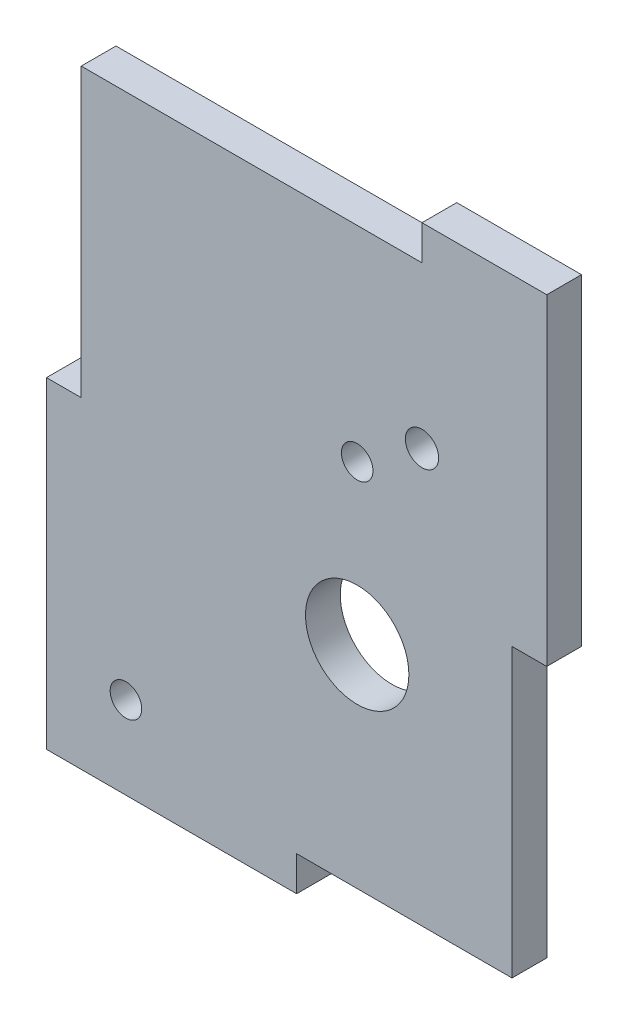
ISO-10303-21;
HEADER;
FILE_DESCRIPTION(('STEP AP214'),'2;1');
FILE_NAME('part.step','',(''),(''),'','','');
FILE_SCHEMA(('AUTOMOTIVE_DESIGN { 1 0 10303 214 1 1 1 1 }'));
ENDSEC;
DATA;
#1=APPLICATION_CONTEXT('core data for automotive mechanical design processes');
#2=APPLICATION_PROTOCOL_DEFINITION('international standard','automotive_design',2000,#1);
#3=PRODUCT_CONTEXT('',#1,'mechanical');
#4=PRODUCT('Part','Part','',(#3));
#5=PRODUCT_RELATED_PRODUCT_CATEGORY('part','',(#4));
#6=PRODUCT_DEFINITION_FORMATION('','',#4);
#7=PRODUCT_DEFINITION_CONTEXT('part definition',#1,'design');
#8=PRODUCT_DEFINITION('design','',#6,#7);
#9=PRODUCT_DEFINITION_SHAPE('','',#8);
#10=(LENGTH_UNIT() NAMED_UNIT(*) SI_UNIT(.MILLI.,.METRE.));
#11=(NAMED_UNIT(*) PLANE_ANGLE_UNIT() SI_UNIT($,.RADIAN.));
#12=(NAMED_UNIT(*) SI_UNIT($,.STERADIAN.) SOLID_ANGLE_UNIT());
#13=UNCERTAINTY_MEASURE_WITH_UNIT(LENGTH_MEASURE(1.E-05),#10,'distance_accuracy_value','');
#14=(GEOMETRIC_REPRESENTATION_CONTEXT(3) GLOBAL_UNCERTAINTY_ASSIGNED_CONTEXT((#13)) GLOBAL_UNIT_ASSIGNED_CONTEXT((#10,
#11,#12)) REPRESENTATION_CONTEXT('',''));
#15=CARTESIAN_POINT('',(0.,0.,0.));
#16=DIRECTION('',(0.,0.,1.));
#17=DIRECTION('',(1.,0.,0.));
#18=AXIS2_PLACEMENT_3D('',#15,#16,#17);
#19=CARTESIAN_POINT('',(19.05,0.,3.0734));
#20=DIRECTION('',(-1.,0.,0.));
#21=DIRECTION('',(0.,-1.,0.));
#22=AXIS2_PLACEMENT_3D('',#19,#20,#21);
#23=PLANE('',#22);
#24=DIRECTION('',(0.,1.,0.));
#25=VECTOR('',#24,1.);
#26=CARTESIAN_POINT('',(19.05,0.,0.));
#27=LINE('',#26,#25);
#28=CARTESIAN_POINT('',(19.05,-3.0734,0.));
#29=VERTEX_POINT('',#28);
#30=CARTESIAN_POINT('',(19.05,0.,0.));
#31=VERTEX_POINT('',#30);
#32=EDGE_CURVE('E168',#29,#31,#27,.T.);
#33=ORIENTED_EDGE('',*,*,#32,.T.);
#34=DIRECTION('',(0.,0.,-1.));
#35=VECTOR('',#34,1.);
#36=CARTESIAN_POINT('',(19.05,0.,3.0734));
#37=LINE('',#36,#35);
#38=CARTESIAN_POINT('',(19.05,0.,3.0734));
#39=VERTEX_POINT('',#38);
#40=EDGE_CURVE('E11',#39,#31,#37,.T.);
#41=ORIENTED_EDGE('',*,*,#40,.F.);
#42=DIRECTION('',(0.,1.,0.));
#43=VECTOR('',#42,1.);
#44=CARTESIAN_POINT('',(19.05,0.,3.0734));
#45=LINE('',#44,#43);
#46=CARTESIAN_POINT('',(19.05,-3.0734,3.0734));
#47=VERTEX_POINT('',#46);
#48=EDGE_CURVE('E209',#47,#39,#45,.T.);
#49=ORIENTED_EDGE('',*,*,#48,.F.);
#50=DIRECTION('',(0.,0.,-1.));
#51=VECTOR('',#50,1.);
#52=CARTESIAN_POINT('',(19.05,-3.0734,3.0734));
#53=LINE('',#52,#51);
#54=EDGE_CURVE('E167',#47,#29,#53,.T.);
#55=ORIENTED_EDGE('',*,*,#54,.T.);
#56=EDGE_LOOP('',(#33,#41,#49,#55));
#57=FACE_BOUND('',#56,.T.);
#58=ADVANCED_FACE('F35',(#57),#23,.F.);
#59=CARTESIAN_POINT('',(0.,0.,3.0734));
#60=DIRECTION('',(0.,1.,0.));
#61=DIRECTION('',(0.,0.,1.));
#62=AXIS2_PLACEMENT_3D('',#59,#60,#61);
#63=PLANE('',#62);
#64=DIRECTION('',(1.,0.,0.));
#65=VECTOR('',#64,1.);
#66=CARTESIAN_POINT('',(0.,0.,0.));
#67=LINE('',#66,#65);
#68=CARTESIAN_POINT('',(38.1,0.,0.));
#69=VERTEX_POINT('',#68);
#70=EDGE_CURVE('E171',#31,#69,#67,.T.);
#71=ORIENTED_EDGE('',*,*,#70,.T.);
#72=DIRECTION('',(0.,0.,-1.));
#73=VECTOR('',#72,1.);
#74=CARTESIAN_POINT('',(38.1,0.,3.0734));
#75=LINE('',#74,#73);
#76=CARTESIAN_POINT('',(38.1,0.,3.0734));
#77=VERTEX_POINT('',#76);
#78=EDGE_CURVE('E43',#77,#69,#75,.T.);
#79=ORIENTED_EDGE('',*,*,#78,.F.);
#80=DIRECTION('',(1.,0.,0.));
#81=VECTOR('',#80,1.);
#82=CARTESIAN_POINT('',(0.,0.,3.0734));
#83=LINE('',#82,#81);
#84=EDGE_CURVE('E106',#39,#77,#83,.T.);
#85=ORIENTED_EDGE('',*,*,#84,.F.);
#86=ORIENTED_EDGE('',*,*,#40,.T.);
#87=EDGE_LOOP('',(#71,#79,#85,#86));
#88=FACE_BOUND('',#87,.T.);
#89=ADVANCED_FACE('F281',(#88),#63,.F.);
#90=CARTESIAN_POINT('',(38.1,0.,3.0734));
#91=DIRECTION('',(-1.,0.,0.));
#92=DIRECTION('',(0.,0.,1.));
#93=AXIS2_PLACEMENT_3D('',#90,#91,#92);
#94=PLANE('',#93);
#95=DIRECTION('',(0.,1.,0.));
#96=VECTOR('',#95,1.);
#97=CARTESIAN_POINT('',(38.1,0.,0.));
#98=LINE('',#97,#96);
#99=CARTESIAN_POINT('',(38.1,25.4,0.));
#100=VERTEX_POINT('',#99);
#101=EDGE_CURVE('E173',#69,#100,#98,.T.);
#102=ORIENTED_EDGE('',*,*,#101,.T.);
#103=DIRECTION('',(0.,0.,-1.));
#104=VECTOR('',#103,1.);
#105=CARTESIAN_POINT('',(38.1,25.4,3.0734));
#106=LINE('',#105,#104);
#107=CARTESIAN_POINT('',(38.1,25.4,3.0734));
#108=VERTEX_POINT('',#107);
#109=EDGE_CURVE('E223',#108,#100,#106,.T.);
#110=ORIENTED_EDGE('',*,*,#109,.F.);
#111=DIRECTION('',(0.,1.,0.));
#112=VECTOR('',#111,1.);
#113=CARTESIAN_POINT('',(38.1,0.,3.0734));
#114=LINE('',#113,#112);
#115=EDGE_CURVE('E230',#77,#108,#114,.T.);
#116=ORIENTED_EDGE('',*,*,#115,.F.);
#117=ORIENTED_EDGE('',*,*,#78,.T.);
#118=EDGE_LOOP('',(#102,#110,#116,#117));
#119=FACE_BOUND('',#118,.T.);
#120=ADVANCED_FACE('F228',(#119),#94,.F.);
#121=CARTESIAN_POINT('',(0.,25.4,3.0734));
#122=DIRECTION('',(0.,-1.,0.));
#123=DIRECTION('',(0.,0.,-1.));
#124=AXIS2_PLACEMENT_3D('',#121,#122,#123);
#125=PLANE('',#124);
#126=DIRECTION('',(-1.,0.,0.));
#127=VECTOR('',#126,1.);
#128=CARTESIAN_POINT('',(0.,25.4,0.));
#129=LINE('',#128,#127);
#130=CARTESIAN_POINT('',(41.1734,25.4,0.));
#131=VERTEX_POINT('',#130);
#132=EDGE_CURVE('E176',#131,#100,#129,.T.);
#133=ORIENTED_EDGE('',*,*,#132,.F.);
#134=DIRECTION('',(0.,0.,-1.));
#135=VECTOR('',#134,1.);
#136=CARTESIAN_POINT('',(41.1734,25.4,3.0734));
#137=LINE('',#136,#135);
#138=CARTESIAN_POINT('',(41.1734,25.4,3.0734));
#139=VERTEX_POINT('',#138);
#140=EDGE_CURVE('E221',#139,#131,#137,.T.);
#141=ORIENTED_EDGE('',*,*,#140,.F.);
#142=DIRECTION('',(-1.,0.,0.));
#143=VECTOR('',#142,1.);
#144=CARTESIAN_POINT('',(0.,25.4,3.0734));
#145=LINE('',#144,#143);
#146=EDGE_CURVE('E241',#139,#108,#145,.T.);
#147=ORIENTED_EDGE('',*,*,#146,.T.);
#148=ORIENTED_EDGE('',*,*,#109,.T.);
#149=EDGE_LOOP('',(#133,#141,#147,#148));
#150=FACE_BOUND('',#149,.T.);
#151=ADVANCED_FACE('F238',(#150),#125,.T.);
#152=CARTESIAN_POINT('',(41.1734,0.,3.0734));
#153=DIRECTION('',(1.,0.,0.));
#154=DIRECTION('',(0.,1.,0.));
#155=AXIS2_PLACEMENT_3D('',#152,#153,#154);
#156=PLANE('',#155);
#157=DIRECTION('',(0.,-1.,0.));
#158=VECTOR('',#157,1.);
#159=CARTESIAN_POINT('',(41.1734,0.,0.));
#160=LINE('',#159,#158);
#161=CARTESIAN_POINT('',(41.1734,53.8734,0.));
#162=VERTEX_POINT('',#161);
#163=EDGE_CURVE('E179',#162,#131,#160,.T.);
#164=ORIENTED_EDGE('',*,*,#163,.F.);
#165=DIRECTION('',(0.,0.,-1.));
#166=VECTOR('',#165,1.);
#167=CARTESIAN_POINT('',(41.1734,53.8734,3.0734));
#168=LINE('',#167,#166);
#169=CARTESIAN_POINT('',(41.1734,53.8734,3.0734));
#170=VERTEX_POINT('',#169);
#171=EDGE_CURVE('E219',#170,#162,#168,.T.);
#172=ORIENTED_EDGE('',*,*,#171,.F.);
#173=DIRECTION('',(0.,-1.,0.));
#174=VECTOR('',#173,1.);
#175=CARTESIAN_POINT('',(41.1734,0.,3.0734));
#176=LINE('',#175,#174);
#177=EDGE_CURVE('E244',#170,#139,#176,.T.);
#178=ORIENTED_EDGE('',*,*,#177,.T.);
#179=ORIENTED_EDGE('',*,*,#140,.T.);
#180=EDGE_LOOP('',(#164,#172,#178,#179));
#181=FACE_BOUND('',#180,.T.);
#182=ADVANCED_FACE('F292',(#181),#156,.T.);
#183=CARTESIAN_POINT('',(0.,53.8734,3.0734));
#184=DIRECTION('',(0.,1.,0.));
#185=DIRECTION('',(-1.,0.,0.));
#186=AXIS2_PLACEMENT_3D('',#183,#184,#185);
#187=PLANE('',#186);
#188=DIRECTION('',(1.,0.,0.));
#189=VECTOR('',#188,1.);
#190=CARTESIAN_POINT('',(0.,53.8734,0.));
#191=LINE('',#190,#189);
#192=CARTESIAN_POINT('',(30.1383434092312,53.8734,0.));
#193=VERTEX_POINT('',#192);
#194=EDGE_CURVE('E182',#193,#162,#191,.T.);
#195=ORIENTED_EDGE('',*,*,#194,.F.);
#196=DIRECTION('',(0.,0.,-1.));
#197=VECTOR('',#196,1.);
#198=CARTESIAN_POINT('',(30.1383434092312,53.8734,3.0734));
#199=LINE('',#198,#197);
#200=CARTESIAN_POINT('',(30.1383434092312,53.8734,3.0734));
#201=VERTEX_POINT('',#200);
#202=EDGE_CURVE('E217',#201,#193,#199,.T.);
#203=ORIENTED_EDGE('',*,*,#202,.F.);
#204=DIRECTION('',(1.,0.,0.));
#205=VECTOR('',#204,1.);
#206=CARTESIAN_POINT('',(0.,53.8734,3.0734));
#207=LINE('',#206,#205);
#208=EDGE_CURVE('E246',#201,#170,#207,.T.);
#209=ORIENTED_EDGE('',*,*,#208,.T.);
#210=ORIENTED_EDGE('',*,*,#171,.T.);
#211=EDGE_LOOP('',(#195,#203,#209,#210));
#212=FACE_BOUND('',#211,.T.);
#213=ADVANCED_FACE('F295',(#212),#187,.T.);
#214=CARTESIAN_POINT('',(30.1383434092312,0.,3.0734));
#215=DIRECTION('',(-1.,0.,0.));
#216=DIRECTION('',(0.,-1.,0.));
#217=AXIS2_PLACEMENT_3D('',#214,#215,#216);
#218=PLANE('',#217);
#219=DIRECTION('',(0.,1.,0.));
#220=VECTOR('',#219,1.);
#221=CARTESIAN_POINT('',(30.1383434092312,0.,0.));
#222=LINE('',#221,#220);
#223=CARTESIAN_POINT('',(30.1383434092312,50.8,0.));
#224=VERTEX_POINT('',#223);
#225=EDGE_CURVE('E185',#224,#193,#222,.T.);
#226=ORIENTED_EDGE('',*,*,#225,.F.);
#227=DIRECTION('',(0.,0.,-1.));
#228=VECTOR('',#227,1.);
#229=CARTESIAN_POINT('',(30.1383434092312,50.8,3.0734));
#230=LINE('',#229,#228);
#231=CARTESIAN_POINT('',(30.1383434092312,50.8,3.0734));
#232=VERTEX_POINT('',#231);
#233=EDGE_CURVE('E215',#232,#224,#230,.T.);
#234=ORIENTED_EDGE('',*,*,#233,.F.);
#235=DIRECTION('',(0.,1.,0.));
#236=VECTOR('',#235,1.);
#237=CARTESIAN_POINT('',(30.1383434092312,0.,3.0734));
#238=LINE('',#237,#236);
#239=EDGE_CURVE('E253',#232,#201,#238,.T.);
#240=ORIENTED_EDGE('',*,*,#239,.T.);
#241=ORIENTED_EDGE('',*,*,#202,.T.);
#242=EDGE_LOOP('',(#226,#234,#240,#241));
#243=FACE_BOUND('',#242,.T.);
#244=ADVANCED_FACE('F299',(#243),#218,.T.);
#245=CARTESIAN_POINT('',(0.,50.8,3.0734));
#246=DIRECTION('',(0.,1.,0.));
#247=DIRECTION('',(0.,0.,1.));
#248=AXIS2_PLACEMENT_3D('',#245,#246,#247);
#249=PLANE('',#248);
#250=DIRECTION('',(1.,0.,0.));
#251=VECTOR('',#250,1.);
#252=CARTESIAN_POINT('',(0.,50.8,0.));
#253=LINE('',#252,#251);
#254=CARTESIAN_POINT('',(0.,50.8,0.));
#255=VERTEX_POINT('',#254);
#256=EDGE_CURVE('E188',#255,#224,#253,.T.);
#257=ORIENTED_EDGE('',*,*,#256,.F.);
#258=DIRECTION('',(0.,0.,-1.));
#259=VECTOR('',#258,1.);
#260=CARTESIAN_POINT('',(0.,50.8,3.0734));
#261=LINE('',#260,#259);
#262=CARTESIAN_POINT('',(0.,50.8,3.0734));
#263=VERTEX_POINT('',#262);
#264=EDGE_CURVE('E213',#263,#255,#261,.T.);
#265=ORIENTED_EDGE('',*,*,#264,.F.);
#266=DIRECTION('',(1.,0.,0.));
#267=VECTOR('',#266,1.);
#268=CARTESIAN_POINT('',(0.,50.8,3.0734));
#269=LINE('',#268,#267);
#270=EDGE_CURVE('E256',#263,#232,#269,.T.);
#271=ORIENTED_EDGE('',*,*,#270,.T.);
#272=ORIENTED_EDGE('',*,*,#233,.T.);
#273=EDGE_LOOP('',(#257,#265,#271,#272));
#274=FACE_BOUND('',#273,.T.);
#275=ADVANCED_FACE('F303',(#274),#249,.T.);
#276=CARTESIAN_POINT('',(0.,0.,3.0734));
#277=DIRECTION('',(-1.,0.,0.));
#278=DIRECTION('',(0.,0.,1.));
#279=AXIS2_PLACEMENT_3D('',#276,#277,#278);
#280=PLANE('',#279);
#281=DIRECTION('',(0.,1.,0.));
#282=VECTOR('',#281,1.);
#283=CARTESIAN_POINT('',(0.,0.,0.));
#284=LINE('',#283,#282);
#285=CARTESIAN_POINT('',(0.,25.4,0.));
#286=VERTEX_POINT('',#285);
#287=EDGE_CURVE('E191',#286,#255,#284,.T.);
#288=ORIENTED_EDGE('',*,*,#287,.F.);
#289=DIRECTION('',(0.,0.,-1.));
#290=VECTOR('',#289,1.);
#291=CARTESIAN_POINT('',(0.,25.4,3.0734));
#292=LINE('',#291,#290);
#293=CARTESIAN_POINT('',(0.,25.4,3.0734));
#294=VERTEX_POINT('',#293);
#295=EDGE_CURVE('E147',#294,#286,#292,.T.);
#296=ORIENTED_EDGE('',*,*,#295,.F.);
#297=DIRECTION('',(0.,1.,0.));
#298=VECTOR('',#297,1.);
#299=CARTESIAN_POINT('',(0.,0.,3.0734));
#300=LINE('',#299,#298);
#301=EDGE_CURVE('E140',#294,#263,#300,.T.);
#302=ORIENTED_EDGE('',*,*,#301,.T.);
#303=ORIENTED_EDGE('',*,*,#264,.T.);
#304=EDGE_LOOP('',(#288,#296,#302,#303));
#305=FACE_BOUND('',#304,.T.);
#306=ADVANCED_FACE('F260',(#305),#280,.T.);
#307=CARTESIAN_POINT('',(0.,25.4,3.0734));
#308=DIRECTION('',(0.,-1.,0.));
#309=DIRECTION('',(0.,0.,-1.));
#310=AXIS2_PLACEMENT_3D('',#307,#308,#309);
#311=PLANE('',#310);
#312=DIRECTION('',(-1.,0.,0.));
#313=VECTOR('',#312,1.);
#314=CARTESIAN_POINT('',(0.,25.4,0.));
#315=LINE('',#314,#313);
#316=CARTESIAN_POINT('',(-3.0734,25.4,0.));
#317=VERTEX_POINT('',#316);
#318=EDGE_CURVE('E146',#286,#317,#315,.T.);
#319=ORIENTED_EDGE('',*,*,#318,.T.);
#320=DIRECTION('',(0.,0.,-1.));
#321=VECTOR('',#320,1.);
#322=CARTESIAN_POINT('',(-3.0734,25.4,3.0734));
#323=LINE('',#322,#321);
#324=CARTESIAN_POINT('',(-3.0734,25.4,3.0734));
#325=VERTEX_POINT('',#324);
#326=EDGE_CURVE('E143',#325,#317,#323,.T.);
#327=ORIENTED_EDGE('',*,*,#326,.F.);
#328=DIRECTION('',(-1.,0.,0.));
#329=VECTOR('',#328,1.);
#330=CARTESIAN_POINT('',(0.,25.4,3.0734));
#331=LINE('',#330,#329);
#332=EDGE_CURVE('E132',#294,#325,#331,.T.);
#333=ORIENTED_EDGE('',*,*,#332,.F.);
#334=ORIENTED_EDGE('',*,*,#295,.T.);
#335=EDGE_LOOP('',(#319,#327,#333,#334));
#336=FACE_BOUND('',#335,.T.);
#337=ADVANCED_FACE('F144',(#336),#311,.F.);
#338=CARTESIAN_POINT('',(-3.0734,0.,3.0734));
#339=DIRECTION('',(1.,0.,0.));
#340=DIRECTION('',(0.,1.,0.));
#341=AXIS2_PLACEMENT_3D('',#338,#339,#340);
#342=PLANE('',#341);
#343=DIRECTION('',(0.,-1.,0.));
#344=VECTOR('',#343,1.);
#345=CARTESIAN_POINT('',(-3.0734,0.,0.));
#346=LINE('',#345,#344);
#347=CARTESIAN_POINT('',(-3.0734,-3.0734,0.));
#348=VERTEX_POINT('',#347);
#349=EDGE_CURVE('E92',#317,#348,#346,.T.);
#350=ORIENTED_EDGE('',*,*,#349,.T.);
#351=DIRECTION('',(0.,0.,-1.));
#352=VECTOR('',#351,1.);
#353=CARTESIAN_POINT('',(-3.0734,-3.0734,3.0734));
#354=LINE('',#353,#352);
#355=CARTESIAN_POINT('',(-3.0734,-3.0734,3.0734));
#356=VERTEX_POINT('',#355);
#357=EDGE_CURVE('E148',#356,#348,#354,.T.);
#358=ORIENTED_EDGE('',*,*,#357,.F.);
#359=DIRECTION('',(0.,-1.,0.));
#360=VECTOR('',#359,1.);
#361=CARTESIAN_POINT('',(-3.0734,0.,3.0734));
#362=LINE('',#361,#360);
#363=EDGE_CURVE('E137',#325,#356,#362,.T.);
#364=ORIENTED_EDGE('',*,*,#363,.F.);
#365=ORIENTED_EDGE('',*,*,#326,.T.);
#366=EDGE_LOOP('',(#350,#358,#364,#365));
#367=FACE_BOUND('',#366,.T.);
#368=ADVANCED_FACE('F150',(#367),#342,.F.);
#369=CARTESIAN_POINT('',(24.40677722816,32.6950449247862,3.0734));
#370=DIRECTION('',(0.,0.,-1.));
#371=DIRECTION('',(-1.,0.,0.));
#372=AXIS2_PLACEMENT_3D('',#369,#370,#371);
#373=CYLINDRICAL_SURFACE('',#372,1.39700000000001);
#374=CARTESIAN_POINT('',(24.40677722816,32.6950449247862,3.0734));
#375=DIRECTION('',(0.,0.,1.));
#376=DIRECTION('',(1.,0.,0.));
#377=AXIS2_PLACEMENT_3D('',#374,#375,#376);
#378=CIRCLE('',#377,1.39700000000001);
#379=CARTESIAN_POINT('',(25.80377722816,32.6950449247862,3.0734));
#380=VERTEX_POINT('',#379);
#381=EDGE_CURVE('E161',#380,#380,#378,.T.);
#382=ORIENTED_EDGE('',*,*,#381,.T.);
#383=EDGE_LOOP('',(#382));
#384=FACE_BOUND('',#383,.T.);
#385=CARTESIAN_POINT('',(24.40677722816,32.6950449247862,0.));
#386=DIRECTION('',(0.,0.,1.));
#387=DIRECTION('',(1.,0.,0.));
#388=AXIS2_PLACEMENT_3D('',#385,#386,#387);
#389=CIRCLE('',#388,1.39700000000001);
#390=CARTESIAN_POINT('',(25.80377722816,32.6950449247862,0.));
#391=VERTEX_POINT('',#390);
#392=EDGE_CURVE('E203',#391,#391,#389,.T.);
#393=ORIENTED_EDGE('',*,*,#392,.F.);
#394=EDGE_LOOP('',(#393));
#395=FACE_BOUND('',#394,.T.);
#396=ADVANCED_FACE('F312',(#384,#395),#373,.F.);
#397=CARTESIAN_POINT('',(24.40677722816,18.6777059918142,3.0734));
#398=DIRECTION('',(0.,0.,-1.));
#399=DIRECTION('',(-1.,0.,0.));
#400=AXIS2_PLACEMENT_3D('',#397,#398,#399);
#401=CYLINDRICAL_SURFACE('',#400,4.572);
#402=CARTESIAN_POINT('',(24.40677722816,18.6777059918142,3.0734));
#403=DIRECTION('',(0.,0.,1.));
#404=DIRECTION('',(1.,0.,0.));
#405=AXIS2_PLACEMENT_3D('',#402,#403,#404);
#406=CIRCLE('',#405,4.572);
#407=CARTESIAN_POINT('',(28.97877722816,18.6777059918142,3.0734));
#408=VERTEX_POINT('',#407);
#409=EDGE_CURVE('E158',#408,#408,#406,.T.);
#410=ORIENTED_EDGE('',*,*,#409,.T.);
#411=EDGE_LOOP('',(#410));
#412=FACE_BOUND('',#411,.T.);
#413=CARTESIAN_POINT('',(24.40677722816,18.6777059918142,0.));
#414=DIRECTION('',(0.,0.,1.));
#415=DIRECTION('',(1.,0.,0.));
#416=AXIS2_PLACEMENT_3D('',#413,#414,#415);
#417=CIRCLE('',#416,4.572);
#418=CARTESIAN_POINT('',(28.97877722816,18.6777059918142,0.));
#419=VERTEX_POINT('',#418);
#420=EDGE_CURVE('E200',#419,#419,#417,.T.);
#421=ORIENTED_EDGE('',*,*,#420,.F.);
#422=EDGE_LOOP('',(#421));
#423=FACE_BOUND('',#422,.T.);
#424=ADVANCED_FACE('F276',(#412,#423),#401,.F.);
#425=CARTESIAN_POINT('',(30.1383434092312,36.57850946853,3.0734));
#426=DIRECTION('',(0.,0.,-1.));
#427=DIRECTION('',(-1.,0.,0.));
#428=AXIS2_PLACEMENT_3D('',#425,#426,#427);
#429=CYLINDRICAL_SURFACE('',#428,1.47319999999999);
#430=CARTESIAN_POINT('',(30.1383434092312,36.57850946853,3.0734));
#431=DIRECTION('',(0.,0.,1.));
#432=DIRECTION('',(1.,0.,0.));
#433=AXIS2_PLACEMENT_3D('',#430,#431,#432);
#434=CIRCLE('',#433,1.47319999999999);
#435=CARTESIAN_POINT('',(31.6115434092312,36.57850946853,3.0734));
#436=VERTEX_POINT('',#435);
#437=EDGE_CURVE('E152',#436,#436,#434,.T.);
#438=ORIENTED_EDGE('',*,*,#437,.T.);
#439=EDGE_LOOP('',(#438));
#440=FACE_BOUND('',#439,.T.);
#441=CARTESIAN_POINT('',(30.1383434092312,36.57850946853,0.));
#442=DIRECTION('',(0.,0.,1.));
#443=DIRECTION('',(1.,0.,0.));
#444=AXIS2_PLACEMENT_3D('',#441,#442,#443);
#445=CIRCLE('',#444,1.47319999999999);
#446=CARTESIAN_POINT('',(31.6115434092312,36.57850946853,0.));
#447=VERTEX_POINT('',#446);
#448=EDGE_CURVE('E197',#447,#447,#445,.T.);
#449=ORIENTED_EDGE('',*,*,#448,.F.);
#450=EDGE_LOOP('',(#449));
#451=FACE_BOUND('',#450,.T.);
#452=ADVANCED_FACE('F268',(#440,#451),#429,.F.);
#453=CARTESIAN_POINT('',(0.,-3.0734,3.0734));
#454=DIRECTION('',(0.,1.,0.));
#455=DIRECTION('',(0.,0.,1.));
#456=AXIS2_PLACEMENT_3D('',#453,#454,#455);
#457=PLANE('',#456);
#458=DIRECTION('',(1.,0.,0.));
#459=VECTOR('',#458,1.);
#460=CARTESIAN_POINT('',(0.,-3.0734,0.));
#461=LINE('',#460,#459);
#462=EDGE_CURVE('E98',#348,#29,#461,.T.);
#463=ORIENTED_EDGE('',*,*,#462,.T.);
#464=ORIENTED_EDGE('',*,*,#54,.F.);
#465=DIRECTION('',(1.,0.,0.));
#466=VECTOR('',#465,1.);
#467=CARTESIAN_POINT('',(0.,-3.0734,3.0734));
#468=LINE('',#467,#466);
#469=EDGE_CURVE('E51',#356,#47,#468,.T.);
#470=ORIENTED_EDGE('',*,*,#469,.F.);
#471=ORIENTED_EDGE('',*,*,#357,.T.);
#472=EDGE_LOOP('',(#463,#464,#470,#471));
#473=FACE_BOUND('',#472,.T.);
#474=ADVANCED_FACE('F265',(#473),#457,.F.);
#475=CARTESIAN_POINT('',(3.95304042471457,4.22949812210942,3.0734));
#476=DIRECTION('',(0.,0.,-1.));
#477=DIRECTION('',(-1.,0.,0.));
#478=AXIS2_PLACEMENT_3D('',#475,#476,#477);
#479=CYLINDRICAL_SURFACE('',#478,1.39700000000001);
#480=CARTESIAN_POINT('',(3.95304042471457,4.22949812210942,3.0734));
#481=DIRECTION('',(0.,0.,1.));
#482=DIRECTION('',(1.,0.,0.));
#483=AXIS2_PLACEMENT_3D('',#480,#481,#482);
#484=CIRCLE('',#483,1.39700000000001);
#485=CARTESIAN_POINT('',(5.35004042471458,4.22949812210942,3.0734));
#486=VERTEX_POINT('',#485);
#487=EDGE_CURVE('E164',#486,#486,#484,.T.);
#488=ORIENTED_EDGE('',*,*,#487,.T.);
#489=EDGE_LOOP('',(#488));
#490=FACE_BOUND('',#489,.T.);
#491=CARTESIAN_POINT('',(3.95304042471457,4.22949812210942,0.));
#492=DIRECTION('',(0.,0.,1.));
#493=DIRECTION('',(1.,0.,0.));
#494=AXIS2_PLACEMENT_3D('',#491,#492,#493);
#495=CIRCLE('',#494,1.39700000000001);
#496=CARTESIAN_POINT('',(5.35004042471458,4.22949812210942,0.));
#497=VERTEX_POINT('',#496);
#498=EDGE_CURVE('E206',#497,#497,#495,.T.);
#499=ORIENTED_EDGE('',*,*,#498,.F.);
#500=EDGE_LOOP('',(#499));
#501=FACE_BOUND('',#500,.T.);
#502=ADVANCED_FACE('F267',(#490,#501),#479,.F.);
#503=CARTESIAN_POINT('',(0.,0.,3.0734));
#504=DIRECTION('',(0.,0.,1.));
#505=DIRECTION('',(1.,0.,0.));
#506=AXIS2_PLACEMENT_3D('',#503,#504,#505);
#507=PLANE('',#506);
#508=ORIENTED_EDGE('',*,*,#48,.T.);
#509=ORIENTED_EDGE('',*,*,#84,.T.);
#510=ORIENTED_EDGE('',*,*,#115,.T.);
#511=ORIENTED_EDGE('',*,*,#146,.F.);
#512=ORIENTED_EDGE('',*,*,#177,.F.);
#513=ORIENTED_EDGE('',*,*,#208,.F.);
#514=ORIENTED_EDGE('',*,*,#239,.F.);
#515=ORIENTED_EDGE('',*,*,#270,.F.);
#516=ORIENTED_EDGE('',*,*,#301,.F.);
#517=ORIENTED_EDGE('',*,*,#332,.T.);
#518=ORIENTED_EDGE('',*,*,#363,.T.);
#519=ORIENTED_EDGE('',*,*,#469,.T.);
#520=EDGE_LOOP('',(#508,#509,#510,#511,#512,#513,#514,#515,#516,#517,#518,#519));
#521=FACE_BOUND('',#520,.T.);
#522=ORIENTED_EDGE('',*,*,#437,.F.);
#523=EDGE_LOOP('',(#522));
#524=FACE_BOUND('',#523,.T.);
#525=ORIENTED_EDGE('',*,*,#409,.F.);
#526=EDGE_LOOP('',(#525));
#527=FACE_BOUND('',#526,.T.);
#528=ORIENTED_EDGE('',*,*,#381,.F.);
#529=EDGE_LOOP('',(#528));
#530=FACE_BOUND('',#529,.T.);
#531=ORIENTED_EDGE('',*,*,#487,.F.);
#532=EDGE_LOOP('',(#531));
#533=FACE_BOUND('',#532,.T.);
#534=ADVANCED_FACE('F134',(#521,#524,#527,#530,#533),#507,.T.);
#535=CARTESIAN_POINT('',(0.,0.,0.));
#536=DIRECTION('',(0.,0.,1.));
#537=DIRECTION('',(1.,0.,0.));
#538=AXIS2_PLACEMENT_3D('',#535,#536,#537);
#539=PLANE('',#538);
#540=ORIENTED_EDGE('',*,*,#32,.F.);
#541=ORIENTED_EDGE('',*,*,#462,.F.);
#542=ORIENTED_EDGE('',*,*,#349,.F.);
#543=ORIENTED_EDGE('',*,*,#318,.F.);
#544=ORIENTED_EDGE('',*,*,#287,.T.);
#545=ORIENTED_EDGE('',*,*,#256,.T.);
#546=ORIENTED_EDGE('',*,*,#225,.T.);
#547=ORIENTED_EDGE('',*,*,#194,.T.);
#548=ORIENTED_EDGE('',*,*,#163,.T.);
#549=ORIENTED_EDGE('',*,*,#132,.T.);
#550=ORIENTED_EDGE('',*,*,#101,.F.);
#551=ORIENTED_EDGE('',*,*,#70,.F.);
#552=EDGE_LOOP('',(#540,#541,#542,#543,#544,#545,#546,#547,#548,#549,#550,#551));
#553=FACE_BOUND('',#552,.T.);
#554=ORIENTED_EDGE('',*,*,#448,.T.);
#555=EDGE_LOOP('',(#554));
#556=FACE_BOUND('',#555,.T.);
#557=ORIENTED_EDGE('',*,*,#420,.T.);
#558=EDGE_LOOP('',(#557));
#559=FACE_BOUND('',#558,.T.);
#560=ORIENTED_EDGE('',*,*,#392,.T.);
#561=EDGE_LOOP('',(#560));
#562=FACE_BOUND('',#561,.T.);
#563=ORIENTED_EDGE('',*,*,#498,.T.);
#564=EDGE_LOOP('',(#563));
#565=FACE_BOUND('',#564,.T.);
#566=ADVANCED_FACE('F233',(#553,#556,#559,#562,#565),#539,.F.);
#567=CLOSED_SHELL('',(#58,#89,#120,#151,#182,#213,#244,#275,#306,#337,#368,#396,#424,#452,#474,
#502,#534,#566));
#568=MANIFOLD_SOLID_BREP('B2',#567);
#569=ADVANCED_BREP_SHAPE_REPRESENTATION('',(#18,#568),#14);
#570=SHAPE_DEFINITION_REPRESENTATION(#9,#569);
ENDSEC;
END-ISO-10303-21;
